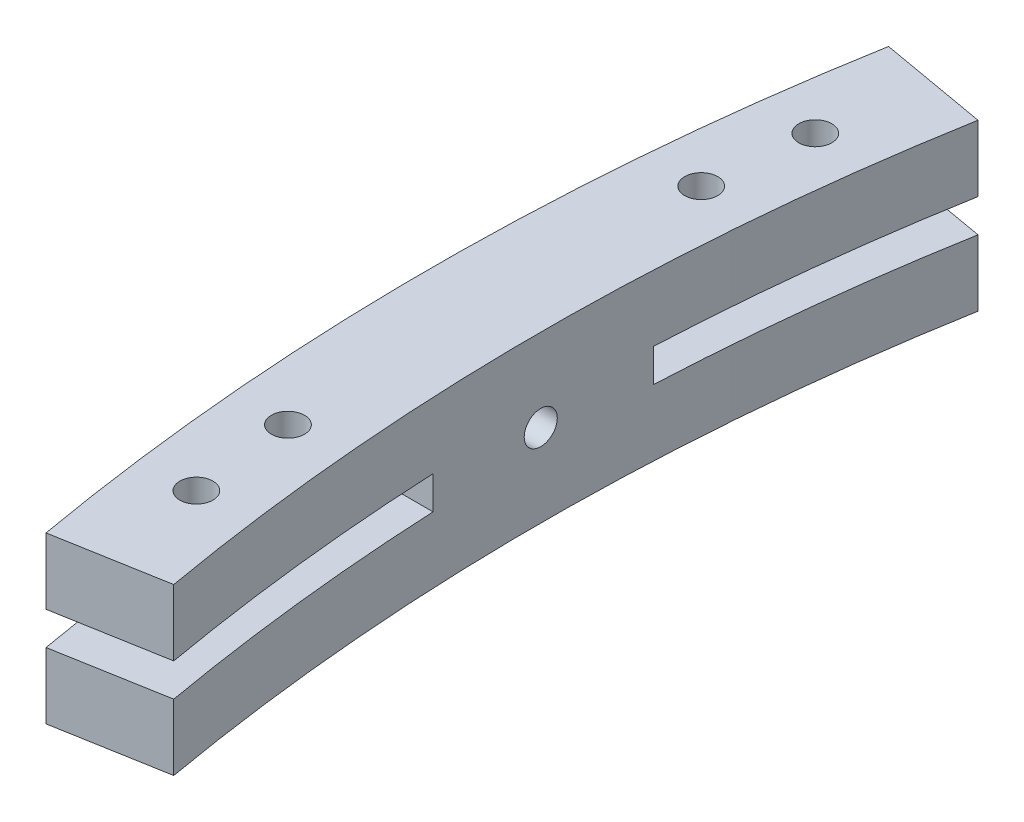
ISO-10303-21;
HEADER;
FILE_DESCRIPTION(('STEP AP214'),'2;1');
FILE_NAME('part.step','',(''),(''),'','','');
FILE_SCHEMA(('AUTOMOTIVE_DESIGN { 1 0 10303 214 1 1 1 1 }'));
ENDSEC;
DATA;
#1=APPLICATION_CONTEXT('core data for automotive mechanical design processes');
#2=APPLICATION_PROTOCOL_DEFINITION('international standard','automotive_design',2000,#1);
#3=PRODUCT_CONTEXT('',#1,'mechanical');
#4=PRODUCT('Part','Part','',(#3));
#5=PRODUCT_RELATED_PRODUCT_CATEGORY('part','',(#4));
#6=PRODUCT_DEFINITION_FORMATION('','',#4);
#7=PRODUCT_DEFINITION_CONTEXT('part definition',#1,'design');
#8=PRODUCT_DEFINITION('design','',#6,#7);
#9=PRODUCT_DEFINITION_SHAPE('','',#8);
#10=(LENGTH_UNIT() NAMED_UNIT(*) SI_UNIT(.MILLI.,.METRE.));
#11=(NAMED_UNIT(*) PLANE_ANGLE_UNIT() SI_UNIT($,.RADIAN.));
#12=(NAMED_UNIT(*) SI_UNIT($,.STERADIAN.) SOLID_ANGLE_UNIT());
#13=UNCERTAINTY_MEASURE_WITH_UNIT(LENGTH_MEASURE(1.E-05),#10,'distance_accuracy_value','');
#14=(GEOMETRIC_REPRESENTATION_CONTEXT(3) GLOBAL_UNCERTAINTY_ASSIGNED_CONTEXT((#13)) GLOBAL_UNIT_ASSIGNED_CONTEXT((#10,
#11,#12)) REPRESENTATION_CONTEXT('',''));
#15=CARTESIAN_POINT('',(0.,0.,0.));
#16=DIRECTION('',(0.,0.,1.));
#17=DIRECTION('',(1.,0.,0.));
#18=AXIS2_PLACEMENT_3D('',#15,#16,#17);
#19=CARTESIAN_POINT('',(-206.809628132564,0.,0.));
#20=DIRECTION('',(-1.,0.,0.));
#21=DIRECTION('',(0.,0.,1.));
#22=AXIS2_PLACEMENT_3D('',#19,#20,#21);
#23=CYLINDRICAL_SURFACE('',#22,1.5);
#24=CARTESIAN_POINT('',(-209.99464278881,0.,1.5));
#25=CARTESIAN_POINT('',(-209.994642861256,0.0842545053988273,1.49999626412144));
#26=CARTESIAN_POINT('',(-209.994694040492,0.168570075887838,1.49287735815229));
#27=CARTESIAN_POINT('',(-209.994893284045,0.334879042949748,1.46457746203871));
#28=CARTESIAN_POINT('',(-209.995041464924,0.416869521731414,1.44337955330763));
#29=CARTESIAN_POINT('',(-209.99541792461,0.576094844285719,1.38752520887204));
#30=CARTESIAN_POINT('',(-209.9956461651,0.653331942229909,1.35287521035549));
#31=CARTESIAN_POINT('',(-209.996156976524,0.800870982943924,1.27110913644876));
#32=CARTESIAN_POINT('',(-209.996439533957,0.871174642468645,1.22399615764886));
#33=CARTESIAN_POINT('',(-209.997027198086,1.00288448190262,1.11863108507892));
#34=CARTESIAN_POINT('',(-209.997332307499,1.06428958794719,1.06037764885883));
#35=CARTESIAN_POINT('',(-209.997930662133,1.17645067444574,0.934386266122501));
#36=CARTESIAN_POINT('',(-209.998223906888,1.22720623636205,0.866647947015294));
#37=CARTESIAN_POINT('',(-209.998765455462,1.31662422922316,0.72361195701347));
#38=CARTESIAN_POINT('',(-209.999013759636,1.35528675624409,0.648314346181809));
#39=CARTESIAN_POINT('',(-209.999437435065,1.41942150706742,0.492296916918281));
#40=CARTESIAN_POINT('',(-209.999612806473,1.44489375888655,0.411577110003811));
#41=CARTESIAN_POINT('',(-209.999870842995,1.48192461939835,0.247007873529466));
#42=CARTESIAN_POINT('',(-209.999953509535,1.49348344229936,0.163158492172376));
#43=CARTESIAN_POINT('',(-210.000016821092,1.50235996600226,-0.00529059506920666));
#44=CARTESIAN_POINT('',(-209.999997466306,1.49967769423306,-0.0898902995082335));
#45=CARTESIAN_POINT('',(-209.999858919038,1.48014842642668,-0.257437054203095));
#46=CARTESIAN_POINT('',(-209.999739728342,1.46330168372159,-0.340384133989024));
#47=CARTESIAN_POINT('',(-209.999414948702,1.41592207106251,-0.502272717811843));
#48=CARTESIAN_POINT('',(-209.999209359661,1.38538918577025,-0.581214217359509));
#49=CARTESIAN_POINT('',(-209.998734958446,1.31150373676353,-0.732851444769979));
#50=CARTESIAN_POINT('',(-209.998466145706,1.26815105822674,-0.805547116683601));
#51=CARTESIAN_POINT('',(-209.997895603089,1.16985678038561,-0.942628440537341));
#52=CARTESIAN_POINT('',(-209.99759387322,1.11491518400418,-1.00701409457338));
#53=CARTESIAN_POINT('',(-209.996991505235,0.995001217275363,-1.12564921209626));
#54=CARTESIAN_POINT('',(-209.996690867144,0.930028621551804,-1.17989844777784));
#55=CARTESIAN_POINT('',(-209.996124584129,0.79189782268297,-1.27671900731056));
#56=CARTESIAN_POINT('',(-209.995858939211,0.718739618455763,-1.31929032961817));
#57=CARTESIAN_POINT('',(-209.995392592773,0.566314233182929,-1.39154655193493));
#58=CARTESIAN_POINT('',(-209.995191891285,0.487047049195099,-1.42123144573768));
#59=CARTESIAN_POINT('',(-209.994878060939,0.324653920085334,-1.46687200401429));
#60=CARTESIAN_POINT('',(-209.994764932064,0.241527975722706,-1.48282767118972));
#61=CARTESIAN_POINT('',(-209.994639003895,0.0737789898117679,-1.50055656780614));
#62=CARTESIAN_POINT('',(-209.994626202383,-0.0108440186025189,-1.50233011074281));
#63=CARTESIAN_POINT('',(-209.994702366419,-0.179186669900936,-1.49164522940729));
#64=CARTESIAN_POINT('',(-209.994791331965,-0.262906312805942,-1.47918680546398));
#65=CARTESIAN_POINT('',(-209.995060998005,-0.427064809807744,-1.44039190557635));
#66=CARTESIAN_POINT('',(-209.995241697565,-0.507503697315076,-1.41405557099983));
#67=CARTESIAN_POINT('',(-209.99567445841,-0.662818277999657,-1.348252607697));
#68=CARTESIAN_POINT('',(-209.995926519696,-0.737693971226156,-1.30878597908692));
#69=CARTESIAN_POINT('',(-209.996473591596,-0.879758112622394,-1.21784196274705));
#70=CARTESIAN_POINT('',(-209.996768602961,-0.946946426417543,-1.16636436511457));
#71=CARTESIAN_POINT('',(-209.997368312373,-1.0717272101147,-1.05285999244139));
#72=CARTESIAN_POINT('',(-209.997673010424,-1.1293196749665,-0.990833211848791));
#73=CARTESIAN_POINT('',(-209.998257747444,-1.23327490913592,-0.857989881681852));
#74=CARTESIAN_POINT('',(-209.998537785962,-1.27963747306654,-0.787173171381687));
#75=CARTESIAN_POINT('',(-209.999041625268,-1.35981536604393,-0.638761157439828));
#76=CARTESIAN_POINT('',(-209.99926542612,-1.39363070919119,-0.561165861415986));
#77=CARTESIAN_POINT('',(-209.999631556664,-1.44775394541876,-0.401400107516963));
#78=CARTESIAN_POINT('',(-209.99977388718,-1.46806197492627,-0.319229695860662));
#79=CARTESIAN_POINT('',(-209.999961033952,-1.49459457294685,-0.152645477616991));
#80=CARTESIAN_POINT('',(-210.000005850049,-1.50081911821868,-0.0682316673276902));
#81=CARTESIAN_POINT('',(-209.999992914919,-1.49900797232406,0.100440778613884));
#82=CARTESIAN_POINT('',(-209.999935166169,-1.4909726253554,0.18469941796245));
#83=CARTESIAN_POINT('',(-209.999723616521,-1.46087045589347,0.350671877199299));
#84=CARTESIAN_POINT('',(-209.99956981543,-1.43880360520357,0.432385691973351));
#85=CARTESIAN_POINT('',(-209.999183496493,-1.38126440266972,0.590950240637917));
#86=CARTESIAN_POINT('',(-209.998950977184,-1.34579180175019,0.667800884140921));
#87=CARTESIAN_POINT('',(-209.998433446986,-1.26244958676533,0.814453095194165));
#88=CARTESIAN_POINT('',(-209.99814843815,-1.21458045728927,0.884254938138904));
#89=CARTESIAN_POINT('',(-209.997558076077,-1.1078084822573,1.01482631695686));
#90=CARTESIAN_POINT('',(-209.997252724519,-1.04890654585269,1.07559659633071));
#91=CARTESIAN_POINT('',(-209.996655999811,-0.921719125114992,1.18640129597209));
#92=CARTESIAN_POINT('',(-209.996364630154,-0.853431312646645,1.23643304467089));
#93=CARTESIAN_POINT('',(-209.995828672365,-0.709397871272207,1.32434124189206));
#94=CARTESIAN_POINT('',(-209.99558410709,-0.633648625695015,1.36221175741431));
#95=CARTESIAN_POINT('',(-209.995169811607,-0.476926535408402,1.42465437505026));
#96=CARTESIAN_POINT('',(-209.994999991756,-0.395960082030267,1.44924241476987));
#97=CARTESIAN_POINT('',(-209.994799958126,-0.262064901070631,1.47787096638032));
#98=CARTESIAN_POINT('',(-209.994741273658,-0.210006143099643,1.48615899263009));
#99=CARTESIAN_POINT('',(-209.994662666358,-0.105306209732217,1.4972246769893));
#100=CARTESIAN_POINT('',(-209.994642743526,-0.0526650343452917,1.50000233518874));
#101=CARTESIAN_POINT('',(-209.99464278881,0.,1.5));
#102=B_SPLINE_CURVE_WITH_KNOTS('',3,(#24,#25,#26,#27,#28,#29,#30,#31,#32,#33,#34,#35,#36,#37,
#38,#39,#40,#41,#42,#43,#44,#45,#46,#47,#48,#49,#50,#51,#52,#53,#54,#55,#56,#57,#58,#59,#60,#61,
#62,#63,#64,#65,#66,#67,#68,#69,#70,#71,#72,#73,#74,#75,#76,#77,#78,#79,#80,#81,#82,#83,#84,#85,
#86,#87,#88,#89,#90,#91,#92,#93,#94,#95,#96,#97,#98,#99,#100,#101),.UNSPECIFIED.,.T.,.F.,(4,2,2,
2,2,2,2,2,2,2,2,2,2,2,2,2,2,2,2,2,2,2,2,2,2,2,2,2,2,2,2,2,2,2,2,2,2,2,4),(0.,0.252571288567426,
0.505446639823259,0.758201132257349,1.01089288342426,1.26361510372079,1.5163472543924,
1.7690773971194,2.02180700303407,2.27453271792522,2.5272579460569,2.77997865428438,
3.03269964574044,3.285422900797,3.5381460921125,3.79087496243105,4.04360386615405,
4.29633289159697,4.54906186730928,4.80178525643525,5.05450863972098,5.30722944868094,
5.55995025540355,5.81267547898481,6.06540083557281,6.31813081398138,6.57086050837281,
6.82358765009336,7.07631520887607,7.32903666753666,7.58175863404866,7.83448529630409,
8.0872020807822,8.33989804945212,8.59265681201468,8.84553869922222,9.09811647633875,
9.25599142606761,9.41386637321819),.UNSPECIFIED.);
#103=CARTESIAN_POINT('',(-209.99464278881,0.,1.5));
#104=VERTEX_POINT('',#103);
#105=EDGE_CURVE('E236',#104,#104,#102,.T.);
#106=ORIENTED_EDGE('',*,*,#105,.F.);
#107=EDGE_LOOP('',(#106));
#108=FACE_BOUND('',#107,.T.);
#109=CARTESIAN_POINT('',(-213.75,0.,0.));
#110=DIRECTION('',(-1.,0.,0.));
#111=DIRECTION('',(0.,0.,1.));
#112=AXIS2_PLACEMENT_3D('',#109,#110,#111);
#113=CIRCLE('',#112,1.5);
#114=CARTESIAN_POINT('',(-213.75,0.,1.5));
#115=VERTEX_POINT('',#114);
#116=EDGE_CURVE('E39',#115,#115,#113,.T.);
#117=ORIENTED_EDGE('',*,*,#116,.T.);
#118=EDGE_LOOP('',(#117));
#119=FACE_BOUND('',#118,.T.);
#120=ADVANCED_FACE('F34',(#108,#119),#23,.F.);
#121=CARTESIAN_POINT('',(0.,7.5,0.));
#122=DIRECTION('',(0.,-1.,0.));
#123=DIRECTION('',(0.,0.,-1.));
#124=AXIS2_PLACEMENT_3D('',#121,#122,#123);
#125=CYLINDRICAL_SURFACE('',#124,210.);
#126=CARTESIAN_POINT('',(0.,1.5,0.));
#127=DIRECTION('',(0.,1.,0.));
#128=DIRECTION('',(0.,0.,1.));
#129=AXIS2_PLACEMENT_3D('',#126,#127,#128);
#130=CIRCLE('',#129,210.);
#131=CARTESIAN_POINT('',(-209.76176963403,1.5,10.));
#132=VERTEX_POINT('',#131);
#133=CARTESIAN_POINT('',(-206.809628132564,1.5,36.4661173100555));
#134=VERTEX_POINT('',#133);
#135=EDGE_CURVE('E160',#132,#134,#130,.T.);
#136=ORIENTED_EDGE('',*,*,#135,.F.);
#137=DIRECTION('',(0.,-1.,0.));
#138=VECTOR('',#137,1.);
#139=CARTESIAN_POINT('',(-209.76176963403,32.5390961188828,10.));
#140=LINE('',#139,#138);
#141=CARTESIAN_POINT('',(-209.76176963403,-1.5,10.));
#142=VERTEX_POINT('',#141);
#143=EDGE_CURVE('E138',#132,#142,#140,.T.);
#144=ORIENTED_EDGE('',*,*,#143,.T.);
#145=CARTESIAN_POINT('',(0.,-1.5,0.));
#146=DIRECTION('',(0.,1.,0.));
#147=DIRECTION('',(0.,0.,1.));
#148=AXIS2_PLACEMENT_3D('',#145,#146,#147);
#149=CIRCLE('',#148,210.);
#150=CARTESIAN_POINT('',(-206.809628132564,-1.5,36.4661173100554));
#151=VERTEX_POINT('',#150);
#152=EDGE_CURVE('E142',#142,#151,#149,.T.);
#153=ORIENTED_EDGE('',*,*,#152,.T.);
#154=DIRECTION('',(0.,-1.,0.));
#155=VECTOR('',#154,1.);
#156=CARTESIAN_POINT('',(-206.809628132564,7.5,36.4661173100555));
#157=LINE('',#156,#155);
#158=CARTESIAN_POINT('',(-206.809628132564,-7.5,36.4661173100555));
#159=VERTEX_POINT('',#158);
#160=EDGE_CURVE('E201',#151,#159,#157,.T.);
#161=ORIENTED_EDGE('',*,*,#160,.T.);
#162=CARTESIAN_POINT('',(0.,-7.5,0.));
#163=DIRECTION('',(0.,1.,0.));
#164=DIRECTION('',(0.,0.,1.));
#165=AXIS2_PLACEMENT_3D('',#162,#163,#164);
#166=CIRCLE('',#165,210.);
#167=CARTESIAN_POINT('',(-206.809628132564,-7.5,-36.4661173100555));
#168=VERTEX_POINT('',#167);
#169=EDGE_CURVE('E164',#168,#159,#166,.T.);
#170=ORIENTED_EDGE('',*,*,#169,.F.);
#171=DIRECTION('',(0.,-1.,0.));
#172=VECTOR('',#171,1.);
#173=CARTESIAN_POINT('',(-206.809628132564,7.5,-36.4661173100555));
#174=LINE('',#173,#172);
#175=CARTESIAN_POINT('',(-206.809628132564,-1.5,-36.4661173100554));
#176=VERTEX_POINT('',#175);
#177=EDGE_CURVE('E44',#176,#168,#174,.T.);
#178=ORIENTED_EDGE('',*,*,#177,.F.);
#179=CARTESIAN_POINT('',(0.,-1.5,0.));
#180=DIRECTION('',(0.,1.,0.));
#181=DIRECTION('',(0.,0.,1.));
#182=AXIS2_PLACEMENT_3D('',#179,#180,#181);
#183=CIRCLE('',#182,210.);
#184=CARTESIAN_POINT('',(-209.76176963403,-1.5,-10.));
#185=VERTEX_POINT('',#184);
#186=EDGE_CURVE('E173',#176,#185,#183,.T.);
#187=ORIENTED_EDGE('',*,*,#186,.T.);
#188=DIRECTION('',(0.,-1.,0.));
#189=VECTOR('',#188,1.);
#190=CARTESIAN_POINT('',(-209.76176963403,32.5390961188828,-10.));
#191=LINE('',#190,#189);
#192=CARTESIAN_POINT('',(-209.76176963403,1.5,-10.));
#193=VERTEX_POINT('',#192);
#194=EDGE_CURVE('E176',#193,#185,#191,.T.);
#195=ORIENTED_EDGE('',*,*,#194,.F.);
#196=CARTESIAN_POINT('',(0.,1.5,0.));
#197=DIRECTION('',(0.,1.,0.));
#198=DIRECTION('',(0.,0.,1.));
#199=AXIS2_PLACEMENT_3D('',#196,#197,#198);
#200=CIRCLE('',#199,210.);
#201=CARTESIAN_POINT('',(-206.809628132564,1.5,-36.4661173100554));
#202=VERTEX_POINT('',#201);
#203=EDGE_CURVE('E180',#193,#202,#200,.F.);
#204=ORIENTED_EDGE('',*,*,#203,.T.);
#205=CARTESIAN_POINT('',(-206.809628132564,7.5,-36.4661173100555));
#206=VERTEX_POINT('',#205);
#207=EDGE_CURVE('E11',#206,#202,#174,.T.);
#208=ORIENTED_EDGE('',*,*,#207,.F.);
#209=CARTESIAN_POINT('',(0.,7.5,0.));
#210=DIRECTION('',(0.,1.,0.));
#211=DIRECTION('',(0.,0.,1.));
#212=AXIS2_PLACEMENT_3D('',#209,#210,#211);
#213=CIRCLE('',#212,210.);
#214=CARTESIAN_POINT('',(-206.809628132564,7.5,36.4661173100555));
#215=VERTEX_POINT('',#214);
#216=EDGE_CURVE('E190',#206,#215,#213,.T.);
#217=ORIENTED_EDGE('',*,*,#216,.T.);
#218=EDGE_CURVE('E211',#215,#134,#157,.T.);
#219=ORIENTED_EDGE('',*,*,#218,.T.);
#220=EDGE_LOOP('',(#136,#144,#153,#161,#170,#178,#187,#195,#204,#208,#217,#219));
#221=FACE_BOUND('',#220,.T.);
#222=ORIENTED_EDGE('',*,*,#105,.T.);
#223=EDGE_LOOP('',(#222));
#224=FACE_BOUND('',#223,.T.);
#225=ADVANCED_FACE('F36',(#221,#224),#125,.F.);
#226=CARTESIAN_POINT('',(0.,7.5,0.));
#227=DIRECTION('',(-0.173648177666931,0.,0.984807753012208));
#228=DIRECTION('',(0.984807753012208,0.,0.173648177666931));
#229=AXIS2_PLACEMENT_3D('',#226,#227,#228);
#230=PLANE('',#229);
#231=DIRECTION('',(0.984807753012208,0.,0.17364817766693));
#232=VECTOR('',#231,1.);
#233=CARTESIAN_POINT('',(-206.809628132564,-1.5,-36.4661173100554));
#234=LINE('',#233,#232);
#235=CARTESIAN_POINT('',(-216.657705662686,-1.5,-38.2025990867248));
#236=VERTEX_POINT('',#235);
#237=EDGE_CURVE('E52',#236,#176,#234,.T.);
#238=ORIENTED_EDGE('',*,*,#237,.T.);
#239=ORIENTED_EDGE('',*,*,#177,.T.);
#240=DIRECTION('',(-0.984807753012208,0.,-0.173648177666931));
#241=VECTOR('',#240,1.);
#242=CARTESIAN_POINT('',(0.,-7.5,0.));
#243=LINE('',#242,#241);
#244=CARTESIAN_POINT('',(-216.657705662686,-7.5,-38.2025990867248));
#245=VERTEX_POINT('',#244);
#246=EDGE_CURVE('E204',#168,#245,#243,.T.);
#247=ORIENTED_EDGE('',*,*,#246,.T.);
#248=DIRECTION('',(0.,-1.,0.));
#249=VECTOR('',#248,1.);
#250=CARTESIAN_POINT('',(-216.657705662686,7.5,-38.2025990867248));
#251=LINE('',#250,#249);
#252=EDGE_CURVE('E217',#236,#245,#251,.T.);
#253=ORIENTED_EDGE('',*,*,#252,.F.);
#254=EDGE_LOOP('',(#238,#239,#247,#253));
#255=FACE_BOUND('',#254,.T.);
#256=ADVANCED_FACE('F308',(#255),#230,.F.);
#257=CARTESIAN_POINT('',(0.,7.5,0.));
#258=DIRECTION('',(0.173648177666931,0.,0.984807753012208));
#259=DIRECTION('',(0.984807753012208,0.,-0.173648177666931));
#260=AXIS2_PLACEMENT_3D('',#257,#258,#259);
#261=PLANE('',#260);
#262=ORIENTED_EDGE('',*,*,#160,.F.);
#263=DIRECTION('',(-0.984807753012208,0.,0.17364817766693));
#264=VECTOR('',#263,1.);
#265=CARTESIAN_POINT('',(-206.809628132564,-1.5,36.4661173100554));
#266=LINE('',#265,#264);
#267=CARTESIAN_POINT('',(-216.657705662686,-1.5,38.2025990867248));
#268=VERTEX_POINT('',#267);
#269=EDGE_CURVE('E157',#151,#268,#266,.T.);
#270=ORIENTED_EDGE('',*,*,#269,.T.);
#271=DIRECTION('',(0.,-1.,0.));
#272=VECTOR('',#271,1.);
#273=CARTESIAN_POINT('',(-216.657705662686,7.5,38.2025990867248));
#274=LINE('',#273,#272);
#275=CARTESIAN_POINT('',(-216.657705662686,-7.5,38.2025990867248));
#276=VERTEX_POINT('',#275);
#277=EDGE_CURVE('E147',#268,#276,#274,.T.);
#278=ORIENTED_EDGE('',*,*,#277,.T.);
#279=DIRECTION('',(-0.984807753012208,0.,0.173648177666931));
#280=VECTOR('',#279,1.);
#281=CARTESIAN_POINT('',(0.,-7.5,0.));
#282=LINE('',#281,#280);
#283=EDGE_CURVE('E194',#159,#276,#282,.T.);
#284=ORIENTED_EDGE('',*,*,#283,.F.);
#285=EDGE_LOOP('',(#262,#270,#278,#284));
#286=FACE_BOUND('',#285,.T.);
#287=ADVANCED_FACE('F303',(#286),#261,.T.);
#288=ORIENTED_EDGE('',*,*,#207,.T.);
#289=DIRECTION('',(-0.984807753012208,0.,-0.17364817766693));
#290=VECTOR('',#289,1.);
#291=CARTESIAN_POINT('',(-206.809628132564,1.5,-36.4661173100554));
#292=LINE('',#291,#290);
#293=CARTESIAN_POINT('',(-216.657705662686,1.5,-38.2025990867249));
#294=VERTEX_POINT('',#293);
#295=EDGE_CURVE('E151',#202,#294,#292,.T.);
#296=ORIENTED_EDGE('',*,*,#295,.T.);
#297=CARTESIAN_POINT('',(-216.657705662686,7.5,-38.2025990867248));
#298=VERTEX_POINT('',#297);
#299=EDGE_CURVE('E218',#298,#294,#251,.T.);
#300=ORIENTED_EDGE('',*,*,#299,.F.);
#301=DIRECTION('',(-0.984807753012208,0.,-0.173648177666931));
#302=VECTOR('',#301,1.);
#303=CARTESIAN_POINT('',(0.,7.5,0.));
#304=LINE('',#303,#302);
#305=EDGE_CURVE('E193',#206,#298,#304,.T.);
#306=ORIENTED_EDGE('',*,*,#305,.F.);
#307=EDGE_LOOP('',(#288,#296,#300,#306));
#308=FACE_BOUND('',#307,.T.);
#309=ADVANCED_FACE('F305',(#308),#230,.F.);
#310=CARTESIAN_POINT('',(0.,7.5,0.));
#311=DIRECTION('',(0.,-1.,0.));
#312=DIRECTION('',(0.,0.,-1.));
#313=AXIS2_PLACEMENT_3D('',#310,#311,#312);
#314=CYLINDRICAL_SURFACE('',#313,220.);
#315=DIRECTION('',(0.,-1.,0.));
#316=VECTOR('',#315,1.);
#317=CARTESIAN_POINT('',(-219.772609758359,32.5390961188828,10.));
#318=LINE('',#317,#316);
#319=CARTESIAN_POINT('',(-219.772609758359,1.5,10.));
#320=VERTEX_POINT('',#319);
#321=CARTESIAN_POINT('',(-219.772609758359,-1.5,10.));
#322=VERTEX_POINT('',#321);
#323=EDGE_CURVE('E129',#320,#322,#318,.T.);
#324=ORIENTED_EDGE('',*,*,#323,.F.);
#325=CARTESIAN_POINT('',(0.,1.5,0.));
#326=DIRECTION('',(0.,1.,0.));
#327=DIRECTION('',(0.,0.,1.));
#328=AXIS2_PLACEMENT_3D('',#325,#326,#327);
#329=CIRCLE('',#328,220.);
#330=CARTESIAN_POINT('',(-216.657705662686,1.5,38.2025990867246));
#331=VERTEX_POINT('',#330);
#332=EDGE_CURVE('E137',#320,#331,#329,.T.);
#333=ORIENTED_EDGE('',*,*,#332,.T.);
#334=CARTESIAN_POINT('',(-216.657705662686,7.5,38.2025990867248));
#335=VERTEX_POINT('',#334);
#336=EDGE_CURVE('E214',#335,#331,#274,.T.);
#337=ORIENTED_EDGE('',*,*,#336,.F.);
#338=CARTESIAN_POINT('',(0.,7.5,0.));
#339=DIRECTION('',(0.,1.,0.));
#340=DIRECTION('',(0.,0.,1.));
#341=AXIS2_PLACEMENT_3D('',#338,#339,#340);
#342=CIRCLE('',#341,220.);
#343=EDGE_CURVE('E196',#298,#335,#342,.T.);
#344=ORIENTED_EDGE('',*,*,#343,.F.);
#345=ORIENTED_EDGE('',*,*,#299,.T.);
#346=CARTESIAN_POINT('',(0.,1.5,0.));
#347=DIRECTION('',(0.,1.,0.));
#348=DIRECTION('',(0.,0.,1.));
#349=AXIS2_PLACEMENT_3D('',#346,#347,#348);
#350=CIRCLE('',#349,220.);
#351=CARTESIAN_POINT('',(-219.772609758359,1.5,-10.));
#352=VERTEX_POINT('',#351);
#353=EDGE_CURVE('E148',#294,#352,#350,.T.);
#354=ORIENTED_EDGE('',*,*,#353,.T.);
#355=DIRECTION('',(0.,-1.,0.));
#356=VECTOR('',#355,1.);
#357=CARTESIAN_POINT('',(-219.772609758359,32.5390961188828,-10.));
#358=LINE('',#357,#356);
#359=CARTESIAN_POINT('',(-219.772609758359,-1.5,-10.));
#360=VERTEX_POINT('',#359);
#361=EDGE_CURVE('E186',#352,#360,#358,.T.);
#362=ORIENTED_EDGE('',*,*,#361,.T.);
#363=CARTESIAN_POINT('',(0.,-1.5,0.));
#364=DIRECTION('',(0.,1.,0.));
#365=DIRECTION('',(0.,0.,1.));
#366=AXIS2_PLACEMENT_3D('',#363,#364,#365);
#367=CIRCLE('',#366,220.);
#368=EDGE_CURVE('E169',#360,#236,#367,.F.);
#369=ORIENTED_EDGE('',*,*,#368,.T.);
#370=ORIENTED_EDGE('',*,*,#252,.T.);
#371=CARTESIAN_POINT('',(0.,-7.5,0.));
#372=DIRECTION('',(0.,1.,0.));
#373=DIRECTION('',(0.,0.,1.));
#374=AXIS2_PLACEMENT_3D('',#371,#372,#373);
#375=CIRCLE('',#374,220.);
#376=EDGE_CURVE('E207',#245,#276,#375,.T.);
#377=ORIENTED_EDGE('',*,*,#376,.T.);
#378=ORIENTED_EDGE('',*,*,#277,.F.);
#379=CARTESIAN_POINT('',(0.,-1.5,0.));
#380=DIRECTION('',(0.,1.,0.));
#381=DIRECTION('',(0.,0.,1.));
#382=AXIS2_PLACEMENT_3D('',#379,#380,#381);
#383=CIRCLE('',#382,220.);
#384=EDGE_CURVE('E60',#322,#268,#383,.T.);
#385=ORIENTED_EDGE('',*,*,#384,.F.);
#386=EDGE_LOOP('',(#324,#333,#337,#344,#345,#354,#362,#369,#370,#377,#378,#385));
#387=FACE_BOUND('',#386,.T.);
#388=ADVANCED_FACE('F145',(#387),#314,.T.);
#389=DIRECTION('',(0.984807753012208,0.,-0.17364817766693));
#390=VECTOR('',#389,1.);
#391=CARTESIAN_POINT('',(-206.809628132564,1.5,36.4661173100554));
#392=LINE('',#391,#390);
#393=EDGE_CURVE('E162',#331,#134,#392,.T.);
#394=ORIENTED_EDGE('',*,*,#393,.T.);
#395=ORIENTED_EDGE('',*,*,#218,.F.);
#396=DIRECTION('',(-0.984807753012208,0.,0.173648177666931));
#397=VECTOR('',#396,1.);
#398=CARTESIAN_POINT('',(0.,7.5,0.));
#399=LINE('',#398,#397);
#400=EDGE_CURVE('E198',#215,#335,#399,.T.);
#401=ORIENTED_EDGE('',*,*,#400,.T.);
#402=ORIENTED_EDGE('',*,*,#336,.T.);
#403=EDGE_LOOP('',(#394,#395,#401,#402));
#404=FACE_BOUND('',#403,.T.);
#405=ADVANCED_FACE('F295',(#404),#261,.T.);
#406=CARTESIAN_POINT('',(0.,7.5,0.));
#407=DIRECTION('',(0.,1.,0.));
#408=DIRECTION('',(0.,0.,1.));
#409=AXIS2_PLACEMENT_3D('',#406,#407,#408);
#410=PLANE('',#409);
#411=CARTESIAN_POINT('',(-213.160645195369,7.5,-28.0631313273113));
#412=DIRECTION('',(0.,1.,0.));
#413=DIRECTION('',(0.,0.,1.));
#414=AXIS2_PLACEMENT_3D('',#411,#412,#413);
#415=CIRCLE('',#414,1.5);
#416=CARTESIAN_POINT('',(-213.160645195369,7.5,-26.5631313273113));
#417=VERTEX_POINT('',#416);
#418=EDGE_CURVE('E355',#417,#417,#415,.T.);
#419=ORIENTED_EDGE('',*,*,#418,.F.);
#420=EDGE_LOOP('',(#419));
#421=FACE_BOUND('',#420,.T.);
#422=CARTESIAN_POINT('',(-214.181860089725,7.5,-18.7384846907465));
#423=DIRECTION('',(0.,1.,0.));
#424=DIRECTION('',(0.,0.,1.));
#425=AXIS2_PLACEMENT_3D('',#422,#423,#424);
#426=CIRCLE('',#425,1.5);
#427=CARTESIAN_POINT('',(-214.181860089725,7.5,-17.2384846907465));
#428=VERTEX_POINT('',#427);
#429=EDGE_CURVE('E361',#428,#428,#426,.T.);
#430=ORIENTED_EDGE('',*,*,#429,.F.);
#431=EDGE_LOOP('',(#430));
#432=FACE_BOUND('',#431,.T.);
#433=CARTESIAN_POINT('',(-214.181860089725,7.5,18.7384846907466));
#434=DIRECTION('',(0.,1.,0.));
#435=DIRECTION('',(0.,0.,-1.));
#436=AXIS2_PLACEMENT_3D('',#433,#434,#435);
#437=CIRCLE('',#436,1.5);
#438=CARTESIAN_POINT('',(-214.181860089725,7.5,17.2384846907466));
#439=VERTEX_POINT('',#438);
#440=EDGE_CURVE('E367',#439,#439,#437,.T.);
#441=ORIENTED_EDGE('',*,*,#440,.F.);
#442=EDGE_LOOP('',(#441));
#443=FACE_BOUND('',#442,.T.);
#444=CARTESIAN_POINT('',(-213.160645195369,7.5,28.0631313273113));
#445=DIRECTION('',(0.,1.,0.));
#446=DIRECTION('',(0.,0.,-1.));
#447=AXIS2_PLACEMENT_3D('',#444,#445,#446);
#448=CIRCLE('',#447,1.5);
#449=CARTESIAN_POINT('',(-213.160645195369,7.5,26.5631313273113));
#450=VERTEX_POINT('',#449);
#451=EDGE_CURVE('E242',#450,#450,#448,.T.);
#452=ORIENTED_EDGE('',*,*,#451,.F.);
#453=EDGE_LOOP('',(#452));
#454=FACE_BOUND('',#453,.T.);
#455=ORIENTED_EDGE('',*,*,#216,.F.);
#456=ORIENTED_EDGE('',*,*,#305,.T.);
#457=ORIENTED_EDGE('',*,*,#343,.T.);
#458=ORIENTED_EDGE('',*,*,#400,.F.);
#459=EDGE_LOOP('',(#455,#456,#457,#458));
#460=FACE_BOUND('',#459,.T.);
#461=ADVANCED_FACE('F292',(#421,#432,#443,#454,#460),#410,.T.);
#462=CARTESIAN_POINT('',(0.,-7.5,0.));
#463=DIRECTION('',(0.,1.,0.));
#464=DIRECTION('',(0.,0.,1.));
#465=AXIS2_PLACEMENT_3D('',#462,#463,#464);
#466=PLANE('',#465);
#467=CARTESIAN_POINT('',(-213.160645195369,-7.5,-28.0631313273113));
#468=DIRECTION('',(0.,1.,0.));
#469=DIRECTION('',(0.,0.,1.));
#470=AXIS2_PLACEMENT_3D('',#467,#468,#469);
#471=CIRCLE('',#470,1.5);
#472=CARTESIAN_POINT('',(-213.160645195369,-7.5,-26.5631313273113));
#473=VERTEX_POINT('',#472);
#474=EDGE_CURVE('E225',#473,#473,#471,.T.);
#475=ORIENTED_EDGE('',*,*,#474,.T.);
#476=EDGE_LOOP('',(#475));
#477=FACE_BOUND('',#476,.T.);
#478=CARTESIAN_POINT('',(-214.181860089725,-7.5,-18.7384846907465));
#479=DIRECTION('',(0.,1.,0.));
#480=DIRECTION('',(0.,0.,1.));
#481=AXIS2_PLACEMENT_3D('',#478,#479,#480);
#482=CIRCLE('',#481,1.5);
#483=CARTESIAN_POINT('',(-214.181860089725,-7.5,-17.2384846907465));
#484=VERTEX_POINT('',#483);
#485=EDGE_CURVE('E358',#484,#484,#482,.T.);
#486=ORIENTED_EDGE('',*,*,#485,.T.);
#487=EDGE_LOOP('',(#486));
#488=FACE_BOUND('',#487,.T.);
#489=CARTESIAN_POINT('',(-214.181860089725,-7.5,18.7384846907466));
#490=DIRECTION('',(0.,1.,0.));
#491=DIRECTION('',(0.,0.,-1.));
#492=AXIS2_PLACEMENT_3D('',#489,#490,#491);
#493=CIRCLE('',#492,1.5);
#494=CARTESIAN_POINT('',(-214.181860089725,-7.5,17.2384846907466));
#495=VERTEX_POINT('',#494);
#496=EDGE_CURVE('E364',#495,#495,#493,.T.);
#497=ORIENTED_EDGE('',*,*,#496,.T.);
#498=EDGE_LOOP('',(#497));
#499=FACE_BOUND('',#498,.T.);
#500=CARTESIAN_POINT('',(-213.160645195369,-7.5,28.0631313273113));
#501=DIRECTION('',(0.,1.,0.));
#502=DIRECTION('',(0.,0.,-1.));
#503=AXIS2_PLACEMENT_3D('',#500,#501,#502);
#504=CIRCLE('',#503,1.5);
#505=CARTESIAN_POINT('',(-213.160645195369,-7.5,26.5631313273113));
#506=VERTEX_POINT('',#505);
#507=EDGE_CURVE('E370',#506,#506,#504,.T.);
#508=ORIENTED_EDGE('',*,*,#507,.T.);
#509=EDGE_LOOP('',(#508));
#510=FACE_BOUND('',#509,.T.);
#511=ORIENTED_EDGE('',*,*,#169,.T.);
#512=ORIENTED_EDGE('',*,*,#283,.T.);
#513=ORIENTED_EDGE('',*,*,#376,.F.);
#514=ORIENTED_EDGE('',*,*,#246,.F.);
#515=EDGE_LOOP('',(#511,#512,#513,#514));
#516=FACE_BOUND('',#515,.T.);
#517=ADVANCED_FACE('F278',(#477,#488,#499,#510,#516),#466,.F.);
#518=CARTESIAN_POINT('',(-209.76176963403,32.5390961188828,10.));
#519=DIRECTION('',(0.,0.,1.));
#520=DIRECTION('',(1.,0.,0.));
#521=AXIS2_PLACEMENT_3D('',#518,#519,#520);
#522=PLANE('',#521);
#523=DIRECTION('',(-1.,0.,0.));
#524=VECTOR('',#523,1.);
#525=CARTESIAN_POINT('',(220.,1.5,10.));
#526=LINE('',#525,#524);
#527=EDGE_CURVE('E134',#132,#320,#526,.T.);
#528=ORIENTED_EDGE('',*,*,#527,.T.);
#529=ORIENTED_EDGE('',*,*,#323,.T.);
#530=DIRECTION('',(-1.,0.,0.));
#531=VECTOR('',#530,1.);
#532=CARTESIAN_POINT('',(220.,-1.5,10.));
#533=LINE('',#532,#531);
#534=EDGE_CURVE('E132',#142,#322,#533,.T.);
#535=ORIENTED_EDGE('',*,*,#534,.F.);
#536=ORIENTED_EDGE('',*,*,#143,.F.);
#537=EDGE_LOOP('',(#528,#529,#535,#536));
#538=FACE_BOUND('',#537,.T.);
#539=ADVANCED_FACE('F130',(#538),#522,.T.);
#540=CARTESIAN_POINT('',(0.,1.5,0.));
#541=DIRECTION('',(0.,1.,0.));
#542=DIRECTION('',(0.,0.,1.));
#543=AXIS2_PLACEMENT_3D('',#540,#541,#542);
#544=PLANE('',#543);
#545=CARTESIAN_POINT('',(-214.181860089725,1.5,18.7384846907466));
#546=DIRECTION('',(0.,1.,0.));
#547=DIRECTION('',(0.,0.,1.));
#548=AXIS2_PLACEMENT_3D('',#545,#546,#547);
#549=CIRCLE('',#548,1.5);
#550=CARTESIAN_POINT('',(-214.181860089725,1.5,20.2384846907466));
#551=VERTEX_POINT('',#550);
#552=EDGE_CURVE('E155',#551,#551,#549,.T.);
#553=ORIENTED_EDGE('',*,*,#552,.T.);
#554=EDGE_LOOP('',(#553));
#555=FACE_BOUND('',#554,.T.);
#556=CARTESIAN_POINT('',(-213.160645195369,1.5,28.0631313273113));
#557=DIRECTION('',(0.,1.,0.));
#558=DIRECTION('',(0.,0.,1.));
#559=AXIS2_PLACEMENT_3D('',#556,#557,#558);
#560=CIRCLE('',#559,1.5);
#561=CARTESIAN_POINT('',(-213.160645195369,1.5,29.5631313273113));
#562=VERTEX_POINT('',#561);
#563=EDGE_CURVE('E233',#562,#562,#560,.T.);
#564=ORIENTED_EDGE('',*,*,#563,.T.);
#565=EDGE_LOOP('',(#564));
#566=FACE_BOUND('',#565,.T.);
#567=ORIENTED_EDGE('',*,*,#332,.F.);
#568=ORIENTED_EDGE('',*,*,#527,.F.);
#569=ORIENTED_EDGE('',*,*,#135,.T.);
#570=ORIENTED_EDGE('',*,*,#393,.F.);
#571=EDGE_LOOP('',(#567,#568,#569,#570));
#572=FACE_BOUND('',#571,.T.);
#573=ADVANCED_FACE('F274',(#555,#566,#572),#544,.F.);
#574=CARTESIAN_POINT('',(0.,-1.5,0.));
#575=DIRECTION('',(0.,1.,0.));
#576=DIRECTION('',(0.,0.,1.));
#577=AXIS2_PLACEMENT_3D('',#574,#575,#576);
#578=PLANE('',#577);
#579=CARTESIAN_POINT('',(-214.181860089725,-1.5,18.7384846907466));
#580=DIRECTION('',(0.,1.,0.));
#581=DIRECTION('',(0.,0.,1.));
#582=AXIS2_PLACEMENT_3D('',#579,#580,#581);
#583=CIRCLE('',#582,1.5);
#584=CARTESIAN_POINT('',(-214.181860089725,-1.5,20.2384846907466));
#585=VERTEX_POINT('',#584);
#586=EDGE_CURVE('E234',#585,#585,#583,.T.);
#587=ORIENTED_EDGE('',*,*,#586,.F.);
#588=EDGE_LOOP('',(#587));
#589=FACE_BOUND('',#588,.T.);
#590=CARTESIAN_POINT('',(-213.160645195369,-1.5,28.0631313273113));
#591=DIRECTION('',(0.,1.,0.));
#592=DIRECTION('',(0.,0.,1.));
#593=AXIS2_PLACEMENT_3D('',#590,#591,#592);
#594=CIRCLE('',#593,1.5);
#595=CARTESIAN_POINT('',(-213.160645195369,-1.5,29.5631313273113));
#596=VERTEX_POINT('',#595);
#597=EDGE_CURVE('E230',#596,#596,#594,.T.);
#598=ORIENTED_EDGE('',*,*,#597,.F.);
#599=EDGE_LOOP('',(#598));
#600=FACE_BOUND('',#599,.T.);
#601=ORIENTED_EDGE('',*,*,#152,.F.);
#602=ORIENTED_EDGE('',*,*,#534,.T.);
#603=ORIENTED_EDGE('',*,*,#384,.T.);
#604=ORIENTED_EDGE('',*,*,#269,.F.);
#605=EDGE_LOOP('',(#601,#602,#603,#604));
#606=FACE_BOUND('',#605,.T.);
#607=ADVANCED_FACE('F140',(#589,#600,#606),#578,.T.);
#608=CARTESIAN_POINT('',(-209.76176963403,32.5390961188828,-10.));
#609=DIRECTION('',(0.,0.,-1.));
#610=DIRECTION('',(-1.,0.,0.));
#611=AXIS2_PLACEMENT_3D('',#608,#609,#610);
#612=PLANE('',#611);
#613=DIRECTION('',(1.,0.,0.));
#614=VECTOR('',#613,1.);
#615=CARTESIAN_POINT('',(-209.76176963403,1.5,-10.));
#616=LINE('',#615,#614);
#617=EDGE_CURVE('E183',#352,#193,#616,.T.);
#618=ORIENTED_EDGE('',*,*,#617,.T.);
#619=ORIENTED_EDGE('',*,*,#194,.T.);
#620=DIRECTION('',(-1.,0.,0.));
#621=VECTOR('',#620,1.);
#622=CARTESIAN_POINT('',(-209.76176963403,-1.5,-10.));
#623=LINE('',#622,#621);
#624=EDGE_CURVE('E171',#185,#360,#623,.T.);
#625=ORIENTED_EDGE('',*,*,#624,.T.);
#626=ORIENTED_EDGE('',*,*,#361,.F.);
#627=EDGE_LOOP('',(#618,#619,#625,#626));
#628=FACE_BOUND('',#627,.T.);
#629=ADVANCED_FACE('F273',(#628),#612,.T.);
#630=CARTESIAN_POINT('',(0.,1.5,0.));
#631=DIRECTION('',(0.,1.,0.));
#632=DIRECTION('',(0.,0.,1.));
#633=AXIS2_PLACEMENT_3D('',#630,#631,#632);
#634=PLANE('',#633);
#635=CARTESIAN_POINT('',(-213.160645195369,1.5,-28.0631313273113));
#636=DIRECTION('',(0.,1.,0.));
#637=DIRECTION('',(0.,0.,1.));
#638=AXIS2_PLACEMENT_3D('',#635,#636,#637);
#639=CIRCLE('',#638,1.5);
#640=CARTESIAN_POINT('',(-213.160645195369,1.5,-26.5631313273113));
#641=VERTEX_POINT('',#640);
#642=EDGE_CURVE('E229',#641,#641,#639,.T.);
#643=ORIENTED_EDGE('',*,*,#642,.T.);
#644=EDGE_LOOP('',(#643));
#645=FACE_BOUND('',#644,.T.);
#646=CARTESIAN_POINT('',(-214.181860089725,1.5,-18.7384846907465));
#647=DIRECTION('',(0.,1.,0.));
#648=DIRECTION('',(0.,0.,1.));
#649=AXIS2_PLACEMENT_3D('',#646,#647,#648);
#650=CIRCLE('',#649,1.5);
#651=CARTESIAN_POINT('',(-214.181860089725,1.5,-17.2384846907465));
#652=VERTEX_POINT('',#651);
#653=EDGE_CURVE('E224',#652,#652,#650,.T.);
#654=ORIENTED_EDGE('',*,*,#653,.T.);
#655=EDGE_LOOP('',(#654));
#656=FACE_BOUND('',#655,.T.);
#657=ORIENTED_EDGE('',*,*,#617,.F.);
#658=ORIENTED_EDGE('',*,*,#353,.F.);
#659=ORIENTED_EDGE('',*,*,#295,.F.);
#660=ORIENTED_EDGE('',*,*,#203,.F.);
#661=EDGE_LOOP('',(#657,#658,#659,#660));
#662=FACE_BOUND('',#661,.T.);
#663=ADVANCED_FACE('F284',(#645,#656,#662),#634,.F.);
#664=CARTESIAN_POINT('',(0.,-1.5,0.));
#665=DIRECTION('',(0.,1.,0.));
#666=DIRECTION('',(0.,0.,1.));
#667=AXIS2_PLACEMENT_3D('',#664,#665,#666);
#668=PLANE('',#667);
#669=CARTESIAN_POINT('',(-213.160645195369,-1.5,-28.0631313273113));
#670=DIRECTION('',(0.,1.,0.));
#671=DIRECTION('',(0.,0.,1.));
#672=AXIS2_PLACEMENT_3D('',#669,#670,#671);
#673=CIRCLE('',#672,1.5);
#674=CARTESIAN_POINT('',(-213.160645195369,-1.5,-26.5631313273113));
#675=VERTEX_POINT('',#674);
#676=EDGE_CURVE('E226',#675,#675,#673,.T.);
#677=ORIENTED_EDGE('',*,*,#676,.F.);
#678=EDGE_LOOP('',(#677));
#679=FACE_BOUND('',#678,.T.);
#680=CARTESIAN_POINT('',(-214.181860089725,-1.5,-18.7384846907465));
#681=DIRECTION('',(0.,1.,0.));
#682=DIRECTION('',(0.,0.,1.));
#683=AXIS2_PLACEMENT_3D('',#680,#681,#682);
#684=CIRCLE('',#683,1.5);
#685=CARTESIAN_POINT('',(-214.181860089725,-1.5,-17.2384846907465));
#686=VERTEX_POINT('',#685);
#687=EDGE_CURVE('E221',#686,#686,#684,.T.);
#688=ORIENTED_EDGE('',*,*,#687,.F.);
#689=EDGE_LOOP('',(#688));
#690=FACE_BOUND('',#689,.T.);
#691=ORIENTED_EDGE('',*,*,#186,.F.);
#692=ORIENTED_EDGE('',*,*,#237,.F.);
#693=ORIENTED_EDGE('',*,*,#368,.F.);
#694=ORIENTED_EDGE('',*,*,#624,.F.);
#695=EDGE_LOOP('',(#691,#692,#693,#694));
#696=FACE_BOUND('',#695,.T.);
#697=ADVANCED_FACE('F259',(#679,#690,#696),#668,.T.);
#698=CARTESIAN_POINT('',(-214.181860089725,-7.5,-18.7384846907465));
#699=DIRECTION('',(0.,1.,0.));
#700=DIRECTION('',(0.,0.,1.));
#701=AXIS2_PLACEMENT_3D('',#698,#699,#700);
#702=CYLINDRICAL_SURFACE('',#701,1.5);
#703=ORIENTED_EDGE('',*,*,#687,.T.);
#704=EDGE_LOOP('',(#703));
#705=FACE_BOUND('',#704,.T.);
#706=ORIENTED_EDGE('',*,*,#485,.F.);
#707=EDGE_LOOP('',(#706));
#708=FACE_BOUND('',#707,.T.);
#709=ADVANCED_FACE('F254',(#705,#708),#702,.F.);
#710=CARTESIAN_POINT('',(-213.160645195369,-7.5,-28.0631313273113));
#711=DIRECTION('',(0.,1.,0.));
#712=DIRECTION('',(0.,0.,1.));
#713=AXIS2_PLACEMENT_3D('',#710,#711,#712);
#714=CYLINDRICAL_SURFACE('',#713,1.5);
#715=ORIENTED_EDGE('',*,*,#676,.T.);
#716=EDGE_LOOP('',(#715));
#717=FACE_BOUND('',#716,.T.);
#718=ORIENTED_EDGE('',*,*,#474,.F.);
#719=EDGE_LOOP('',(#718));
#720=FACE_BOUND('',#719,.T.);
#721=ADVANCED_FACE('F250',(#717,#720),#714,.F.);
#722=ORIENTED_EDGE('',*,*,#429,.T.);
#723=EDGE_LOOP('',(#722));
#724=FACE_BOUND('',#723,.T.);
#725=ORIENTED_EDGE('',*,*,#653,.F.);
#726=EDGE_LOOP('',(#725));
#727=FACE_BOUND('',#726,.T.);
#728=ADVANCED_FACE('F253',(#724,#727),#702,.F.);
#729=ORIENTED_EDGE('',*,*,#418,.T.);
#730=EDGE_LOOP('',(#729));
#731=FACE_BOUND('',#730,.T.);
#732=ORIENTED_EDGE('',*,*,#642,.F.);
#733=EDGE_LOOP('',(#732));
#734=FACE_BOUND('',#733,.T.);
#735=ADVANCED_FACE('F256',(#731,#734),#714,.F.);
#736=CARTESIAN_POINT('',(-213.160645195369,-7.5,28.0631313273113));
#737=DIRECTION('',(0.,1.,0.));
#738=DIRECTION('',(0.,0.,1.));
#739=AXIS2_PLACEMENT_3D('',#736,#737,#738);
#740=CYLINDRICAL_SURFACE('',#739,1.5);
#741=ORIENTED_EDGE('',*,*,#597,.T.);
#742=EDGE_LOOP('',(#741));
#743=FACE_BOUND('',#742,.T.);
#744=ORIENTED_EDGE('',*,*,#507,.F.);
#745=EDGE_LOOP('',(#744));
#746=FACE_BOUND('',#745,.T.);
#747=ADVANCED_FACE('F265',(#743,#746),#740,.F.);
#748=CARTESIAN_POINT('',(-214.181860089725,-7.5,18.7384846907466));
#749=DIRECTION('',(0.,1.,0.));
#750=DIRECTION('',(0.,0.,1.));
#751=AXIS2_PLACEMENT_3D('',#748,#749,#750);
#752=CYLINDRICAL_SURFACE('',#751,1.5);
#753=ORIENTED_EDGE('',*,*,#586,.T.);
#754=EDGE_LOOP('',(#753));
#755=FACE_BOUND('',#754,.T.);
#756=ORIENTED_EDGE('',*,*,#496,.F.);
#757=EDGE_LOOP('',(#756));
#758=FACE_BOUND('',#757,.T.);
#759=ADVANCED_FACE('F261',(#755,#758),#752,.F.);
#760=ORIENTED_EDGE('',*,*,#451,.T.);
#761=EDGE_LOOP('',(#760));
#762=FACE_BOUND('',#761,.T.);
#763=ORIENTED_EDGE('',*,*,#563,.F.);
#764=EDGE_LOOP('',(#763));
#765=FACE_BOUND('',#764,.T.);
#766=ADVANCED_FACE('F264',(#762,#765),#740,.F.);
#767=ORIENTED_EDGE('',*,*,#440,.T.);
#768=EDGE_LOOP('',(#767));
#769=FACE_BOUND('',#768,.T.);
#770=ORIENTED_EDGE('',*,*,#552,.F.);
#771=EDGE_LOOP('',(#770));
#772=FACE_BOUND('',#771,.T.);
#773=ADVANCED_FACE('F267',(#769,#772),#752,.F.);
#774=CARTESIAN_POINT('',(-213.75,0.,-2.99999999999999));
#775=DIRECTION('',(-1.,0.,0.));
#776=DIRECTION('',(0.,0.,1.));
#777=AXIS2_PLACEMENT_3D('',#774,#775,#776);
#778=PLANE('',#777);
#779=ORIENTED_EDGE('',*,*,#116,.F.);
#780=EDGE_LOOP('',(#779));
#781=FACE_BOUND('',#780,.T.);
#782=CARTESIAN_POINT('',(-213.75,0.,0.));
#783=DIRECTION('',(-1.,0.,0.));
#784=DIRECTION('',(0.,0.,1.));
#785=AXIS2_PLACEMENT_3D('',#782,#783,#784);
#786=CIRCLE('',#785,2.99999999999999);
#787=CARTESIAN_POINT('',(-213.75,0.,2.99999999999999));
#788=VERTEX_POINT('',#787);
#789=EDGE_CURVE('E346',#788,#788,#786,.T.);
#790=ORIENTED_EDGE('',*,*,#789,.T.);
#791=EDGE_LOOP('',(#790));
#792=FACE_BOUND('',#791,.T.);
#793=ADVANCED_FACE('F248',(#781,#792),#778,.T.);
#794=CARTESIAN_POINT('',(-215.,0.,0.));
#795=DIRECTION('',(-1.,0.,0.));
#796=DIRECTION('',(0.,0.,1.));
#797=AXIS2_PLACEMENT_3D('',#794,#795,#796);
#798=CYLINDRICAL_SURFACE('',#797,2.99999999999999);
#799=CARTESIAN_POINT('',(-216.25,0.,0.));
#800=DIRECTION('',(-1.,0.,0.));
#801=DIRECTION('',(0.,0.,1.));
#802=AXIS2_PLACEMENT_3D('',#799,#800,#801);
#803=CIRCLE('',#802,2.99999999999999);
#804=CARTESIAN_POINT('',(-216.25,0.,2.99999999999999));
#805=VERTEX_POINT('',#804);
#806=EDGE_CURVE('E348',#805,#805,#803,.T.);
#807=ORIENTED_EDGE('',*,*,#806,.T.);
#808=EDGE_LOOP('',(#807));
#809=FACE_BOUND('',#808,.T.);
#810=ORIENTED_EDGE('',*,*,#789,.F.);
#811=EDGE_LOOP('',(#810));
#812=FACE_BOUND('',#811,.T.);
#813=ADVANCED_FACE('F395',(#809,#812),#798,.F.);
#814=CARTESIAN_POINT('',(-216.25,0.,-2.99999999999999));
#815=DIRECTION('',(1.,0.,0.));
#816=DIRECTION('',(0.,0.,-1.));
#817=AXIS2_PLACEMENT_3D('',#814,#815,#816);
#818=PLANE('',#817);
#819=ORIENTED_EDGE('',*,*,#806,.F.);
#820=EDGE_LOOP('',(#819));
#821=FACE_BOUND('',#820,.T.);
#822=ADVANCED_FACE('F404',(#821),#818,.T.);
#823=CLOSED_SHELL('',(#120,#225,#256,#287,#309,#388,#405,#461,#517,#539,#573,#607,#629,#663,
#697,#709,#721,#728,#735,#747,#759,#766,#773,#793,#813,#822));
#824=MANIFOLD_SOLID_BREP('B2',#823);
#825=ADVANCED_BREP_SHAPE_REPRESENTATION('',(#18,#824),#14);
#826=SHAPE_DEFINITION_REPRESENTATION(#9,#825);
ENDSEC;
END-ISO-10303-21;
